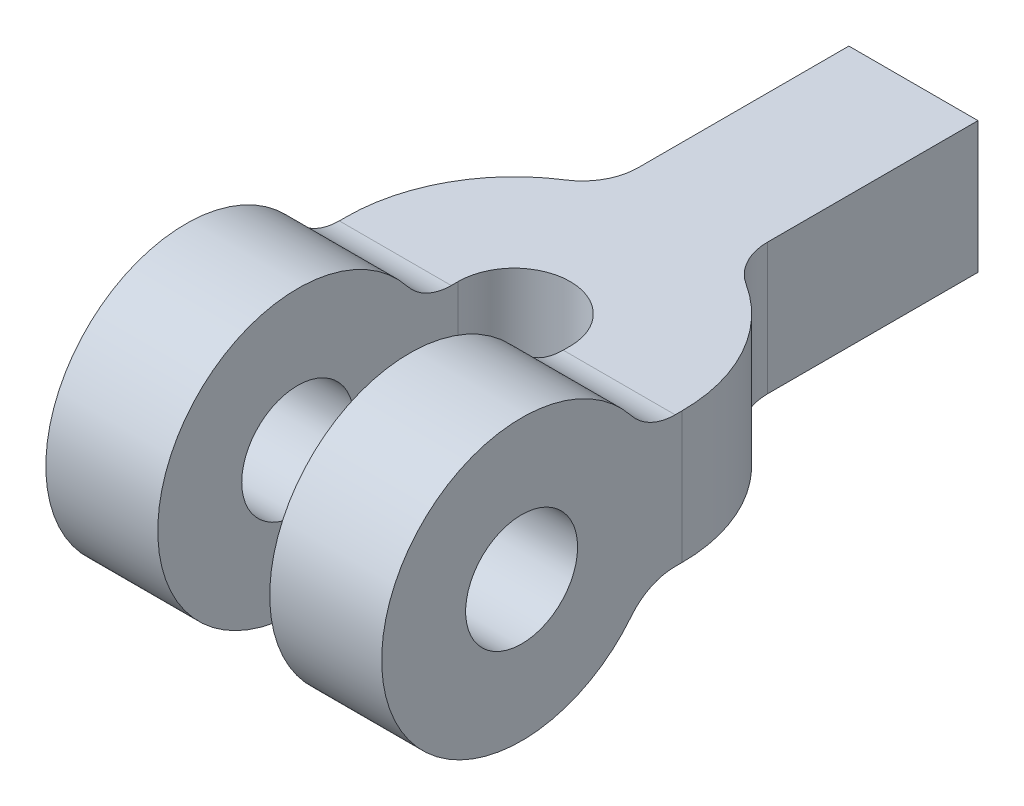
ISO-10303-21;
HEADER;
FILE_DESCRIPTION(('STEP AP214'),'2;1');
FILE_NAME('part.step','',(''),(''),'','','');
FILE_SCHEMA(('AUTOMOTIVE_DESIGN { 1 0 10303 214 1 1 1 1 }'));
ENDSEC;
DATA;
#1=APPLICATION_CONTEXT('core data for automotive mechanical design processes');
#2=APPLICATION_PROTOCOL_DEFINITION('international standard','automotive_design',2000,#1);
#3=PRODUCT_CONTEXT('',#1,'mechanical');
#4=PRODUCT('Part','Part','',(#3));
#5=PRODUCT_RELATED_PRODUCT_CATEGORY('part','',(#4));
#6=PRODUCT_DEFINITION_FORMATION('','',#4);
#7=PRODUCT_DEFINITION_CONTEXT('part definition',#1,'design');
#8=PRODUCT_DEFINITION('design','',#6,#7);
#9=PRODUCT_DEFINITION_SHAPE('','',#8);
#10=(LENGTH_UNIT() NAMED_UNIT(*) SI_UNIT(.MILLI.,.METRE.));
#11=(NAMED_UNIT(*) PLANE_ANGLE_UNIT() SI_UNIT($,.RADIAN.));
#12=(NAMED_UNIT(*) SI_UNIT($,.STERADIAN.) SOLID_ANGLE_UNIT());
#13=UNCERTAINTY_MEASURE_WITH_UNIT(LENGTH_MEASURE(1.E-05),#10,'distance_accuracy_value','');
#14=(GEOMETRIC_REPRESENTATION_CONTEXT(3) GLOBAL_UNCERTAINTY_ASSIGNED_CONTEXT((#13)) GLOBAL_UNIT_ASSIGNED_CONTEXT((#10,
#11,#12)) REPRESENTATION_CONTEXT('',''));
#15=CARTESIAN_POINT('',(0.,0.,0.));
#16=DIRECTION('',(0.,0.,1.));
#17=DIRECTION('',(1.,0.,0.));
#18=AXIS2_PLACEMENT_3D('',#15,#16,#17);
#19=CARTESIAN_POINT('',(-21.,67.5,58.8508644021294));
#20=DIRECTION('',(1.,0.,0.));
#21=DIRECTION('',(0.,0.,-1.));
#22=AXIS2_PLACEMENT_3D('',#19,#20,#21);
#23=PLANE('',#22);
#24=CARTESIAN_POINT('',(-21.,50.,41.3508644021294));
#25=DIRECTION('',(1.,0.,0.));
#26=DIRECTION('',(0.,0.,-1.));
#27=AXIS2_PLACEMENT_3D('',#24,#25,#26);
#28=CIRCLE('',#27,7.);
#29=CARTESIAN_POINT('',(-21.,50.,34.3508644021294));
#30=VERTEX_POINT('',#29);
#31=EDGE_CURVE('E286',#30,#30,#28,.T.);
#32=ORIENTED_EDGE('',*,*,#31,.T.);
#33=EDGE_LOOP('',(#32));
#34=FACE_BOUND('',#33,.T.);
#35=DIRECTION('',(0.,0.,-1.));
#36=VECTOR('',#35,1.);
#37=CARTESIAN_POINT('',(-21.,41.7837570915777,15.1008644021294));
#38=LINE('',#37,#36);
#39=CARTESIAN_POINT('',(-21.,41.7837570915777,22.1488865937918));
#40=VERTEX_POINT('',#39);
#41=CARTESIAN_POINT('',(-21.,41.7837570915777,21.2764778737688));
#42=VERTEX_POINT('',#41);
#43=EDGE_CURVE('E190',#40,#42,#38,.T.);
#44=ORIENTED_EDGE('',*,*,#43,.F.);
#45=CARTESIAN_POINT('',(-21.,34.7837570915777,22.1488865937918));
#46=DIRECTION('',(1.,0.,0.));
#47=DIRECTION('',(0.,0.,-1.));
#48=AXIS2_PLACEMENT_3D('',#45,#46,#47);
#49=CIRCLE('',#48,7.);
#50=CARTESIAN_POINT('',(-21.,39.1312550654127,27.6351659676026));
#51=VERTEX_POINT('',#50);
#52=EDGE_CURVE('E200',#40,#51,#49,.T.);
#53=ORIENTED_EDGE('',*,*,#52,.T.);
#54=CARTESIAN_POINT('',(-21.,50.,41.3508644021294));
#55=DIRECTION('',(1.,0.,0.));
#56=DIRECTION('',(0.,0.,-1.));
#57=AXIS2_PLACEMENT_3D('',#54,#55,#56);
#58=CIRCLE('',#57,17.5);
#59=CARTESIAN_POINT('',(-21.,60.8687449345873,27.6351659676026));
#60=VERTEX_POINT('',#59);
#61=EDGE_CURVE('E296',#60,#51,#58,.T.);
#62=ORIENTED_EDGE('',*,*,#61,.F.);
#63=CARTESIAN_POINT('',(-21.,65.2162429084223,22.1488865937918));
#64=DIRECTION('',(1.,0.,0.));
#65=DIRECTION('',(0.,0.,-1.));
#66=AXIS2_PLACEMENT_3D('',#63,#64,#65);
#67=CIRCLE('',#66,7.);
#68=CARTESIAN_POINT('',(-21.,58.2162429084223,22.1488865937918));
#69=VERTEX_POINT('',#68);
#70=EDGE_CURVE('E223',#69,#60,#67,.F.);
#71=ORIENTED_EDGE('',*,*,#70,.F.);
#72=DIRECTION('',(0.,0.,-1.));
#73=VECTOR('',#72,1.);
#74=CARTESIAN_POINT('',(-21.,58.2162429084223,15.1008644021294));
#75=LINE('',#74,#73);
#76=CARTESIAN_POINT('',(-21.,58.2162429084223,21.2764778737688));
#77=VERTEX_POINT('',#76);
#78=EDGE_CURVE('E226',#69,#77,#75,.T.);
#79=ORIENTED_EDGE('',*,*,#78,.T.);
#80=DIRECTION('',(0.,1.,0.));
#81=VECTOR('',#80,1.);
#82=CARTESIAN_POINT('',(-21.,32.5,21.2764778737688));
#83=LINE('',#82,#81);
#84=EDGE_CURVE('E209',#42,#77,#83,.T.);
#85=ORIENTED_EDGE('',*,*,#84,.F.);
#86=EDGE_LOOP('',(#44,#53,#62,#71,#79,#85));
#87=FACE_BOUND('',#86,.T.);
#88=ADVANCED_FACE('F62',(#34,#87),#23,.F.);
#89=CARTESIAN_POINT('',(21.,67.5,58.8508644021294));
#90=DIRECTION('',(-1.,0.,0.));
#91=DIRECTION('',(0.,0.,1.));
#92=AXIS2_PLACEMENT_3D('',#89,#90,#91);
#93=PLANE('',#92);
#94=CARTESIAN_POINT('',(21.,50.,41.3508644021294));
#95=DIRECTION('',(1.,0.,0.));
#96=DIRECTION('',(0.,0.,-1.));
#97=AXIS2_PLACEMENT_3D('',#94,#95,#96);
#98=CIRCLE('',#97,7.);
#99=CARTESIAN_POINT('',(21.,50.,34.3508644021294));
#100=VERTEX_POINT('',#99);
#101=EDGE_CURVE('E285',#100,#100,#98,.T.);
#102=ORIENTED_EDGE('',*,*,#101,.F.);
#103=EDGE_LOOP('',(#102));
#104=FACE_BOUND('',#103,.T.);
#105=DIRECTION('',(0.,0.,-1.));
#106=VECTOR('',#105,1.);
#107=CARTESIAN_POINT('',(21.,41.7837570915777,15.1008644021294));
#108=LINE('',#107,#106);
#109=CARTESIAN_POINT('',(21.,41.7837570915777,22.1488865937918));
#110=VERTEX_POINT('',#109);
#111=CARTESIAN_POINT('',(21.,41.7837570915777,21.2764778737688));
#112=VERTEX_POINT('',#111);
#113=EDGE_CURVE('E213',#110,#112,#108,.T.);
#114=ORIENTED_EDGE('',*,*,#113,.T.);
#115=DIRECTION('',(0.,1.,0.));
#116=VECTOR('',#115,1.);
#117=CARTESIAN_POINT('',(21.,32.5,21.2764778737688));
#118=LINE('',#117,#116);
#119=CARTESIAN_POINT('',(21.,58.2162429084223,21.2764778737688));
#120=VERTEX_POINT('',#119);
#121=EDGE_CURVE('E314',#112,#120,#118,.T.);
#122=ORIENTED_EDGE('',*,*,#121,.T.);
#123=DIRECTION('',(0.,0.,-1.));
#124=VECTOR('',#123,1.);
#125=CARTESIAN_POINT('',(21.,58.2162429084223,15.1008644021294));
#126=LINE('',#125,#124);
#127=CARTESIAN_POINT('',(21.,58.2162429084223,22.1488865937918));
#128=VERTEX_POINT('',#127);
#129=EDGE_CURVE('E227',#128,#120,#126,.T.);
#130=ORIENTED_EDGE('',*,*,#129,.F.);
#131=CARTESIAN_POINT('',(21.,65.2162429084223,22.1488865937918));
#132=DIRECTION('',(1.,0.,0.));
#133=DIRECTION('',(0.,0.,-1.));
#134=AXIS2_PLACEMENT_3D('',#131,#132,#133);
#135=CIRCLE('',#134,7.);
#136=CARTESIAN_POINT('',(21.,60.8687449345873,27.6351659676026));
#137=VERTEX_POINT('',#136);
#138=EDGE_CURVE('E230',#128,#137,#135,.F.);
#139=ORIENTED_EDGE('',*,*,#138,.T.);
#140=CARTESIAN_POINT('',(21.,50.,41.3508644021294));
#141=DIRECTION('',(1.,0.,0.));
#142=DIRECTION('',(0.,0.,-1.));
#143=AXIS2_PLACEMENT_3D('',#140,#141,#142);
#144=CIRCLE('',#143,17.5);
#145=CARTESIAN_POINT('',(21.,39.1312550654127,27.6351659676026));
#146=VERTEX_POINT('',#145);
#147=EDGE_CURVE('E295',#137,#146,#144,.T.);
#148=ORIENTED_EDGE('',*,*,#147,.T.);
#149=CARTESIAN_POINT('',(21.,34.7837570915777,22.1488865937918));
#150=DIRECTION('',(1.,0.,0.));
#151=DIRECTION('',(0.,0.,-1.));
#152=AXIS2_PLACEMENT_3D('',#149,#150,#151);
#153=CIRCLE('',#152,7.);
#154=EDGE_CURVE('E210',#110,#146,#153,.T.);
#155=ORIENTED_EDGE('',*,*,#154,.F.);
#156=EDGE_LOOP('',(#114,#122,#130,#139,#148,#155));
#157=FACE_BOUND('',#156,.T.);
#158=ADVANCED_FACE('F361',(#104,#157),#93,.F.);
#159=CARTESIAN_POINT('',(7.00000000000002,32.5,15.1008644021294));
#160=DIRECTION('',(-1.,0.,0.));
#161=DIRECTION('',(0.,0.,1.));
#162=AXIS2_PLACEMENT_3D('',#159,#160,#161);
#163=PLANE('',#162);
#164=CARTESIAN_POINT('',(7.00000000000002,50.,41.3508644021294));
#165=DIRECTION('',(-1.,0.,0.));
#166=DIRECTION('',(0.,0.,1.));
#167=AXIS2_PLACEMENT_3D('',#164,#165,#166);
#168=CIRCLE('',#167,7.);
#169=CARTESIAN_POINT('',(7.00000000000002,50.,48.3508644021294));
#170=VERTEX_POINT('',#169);
#171=EDGE_CURVE('E292',#170,#170,#168,.T.);
#172=ORIENTED_EDGE('',*,*,#171,.F.);
#173=EDGE_LOOP('',(#172));
#174=FACE_BOUND('',#173,.T.);
#175=DIRECTION('',(0.,1.,0.));
#176=VECTOR('',#175,1.);
#177=CARTESIAN_POINT('',(7.00000000000002,32.5,21.2764778737688));
#178=LINE('',#177,#176);
#179=CARTESIAN_POINT('',(7.00000000000002,41.7837570915777,21.2764778737688));
#180=VERTEX_POINT('',#179);
#181=CARTESIAN_POINT('',(7.00000000000002,58.2162429084223,21.2764778737688));
#182=VERTEX_POINT('',#181);
#183=EDGE_CURVE('E323',#180,#182,#178,.T.);
#184=ORIENTED_EDGE('',*,*,#183,.F.);
#185=DIRECTION('',(0.,0.,1.));
#186=VECTOR('',#185,1.);
#187=CARTESIAN_POINT('',(7.00000000000002,41.7837570915777,15.1008644021294));
#188=LINE('',#187,#186);
#189=CARTESIAN_POINT('',(7.00000000000002,41.7837570915777,22.1488865937918));
#190=VERTEX_POINT('',#189);
#191=EDGE_CURVE('E277',#180,#190,#188,.T.);
#192=ORIENTED_EDGE('',*,*,#191,.T.);
#193=CARTESIAN_POINT('',(7.00000000000002,34.7837570915777,22.1488865937918));
#194=DIRECTION('',(-1.,0.,0.));
#195=DIRECTION('',(0.,0.,1.));
#196=AXIS2_PLACEMENT_3D('',#193,#194,#195);
#197=CIRCLE('',#196,7.);
#198=CARTESIAN_POINT('',(7.00000000000002,39.1312550654127,27.6351659676026));
#199=VERTEX_POINT('',#198);
#200=EDGE_CURVE('E283',#199,#190,#197,.T.);
#201=ORIENTED_EDGE('',*,*,#200,.F.);
#202=CARTESIAN_POINT('',(7.00000000000002,50.,41.3508644021294));
#203=DIRECTION('',(-1.,0.,0.));
#204=DIRECTION('',(0.,0.,1.));
#205=AXIS2_PLACEMENT_3D('',#202,#203,#204);
#206=CIRCLE('',#205,17.5);
#207=CARTESIAN_POINT('',(7.00000000000002,60.8687449345873,27.6351659676026));
#208=VERTEX_POINT('',#207);
#209=EDGE_CURVE('E76',#199,#208,#206,.T.);
#210=ORIENTED_EDGE('',*,*,#209,.T.);
#211=CARTESIAN_POINT('',(7.00000000000002,65.2162429084223,22.1488865937918));
#212=DIRECTION('',(-1.,0.,0.));
#213=DIRECTION('',(0.,0.,1.));
#214=AXIS2_PLACEMENT_3D('',#211,#212,#213);
#215=CIRCLE('',#214,7.);
#216=CARTESIAN_POINT('',(7.00000000000002,58.2162429084223,22.1488865937918));
#217=VERTEX_POINT('',#216);
#218=EDGE_CURVE('E280',#208,#217,#215,.F.);
#219=ORIENTED_EDGE('',*,*,#218,.T.);
#220=DIRECTION('',(0.,0.,1.));
#221=VECTOR('',#220,1.);
#222=CARTESIAN_POINT('',(7.00000000000002,58.2162429084223,15.1008644021294));
#223=LINE('',#222,#221);
#224=EDGE_CURVE('E260',#182,#217,#223,.T.);
#225=ORIENTED_EDGE('',*,*,#224,.F.);
#226=EDGE_LOOP('',(#184,#192,#201,#210,#219,#225));
#227=FACE_BOUND('',#226,.T.);
#228=ADVANCED_FACE('F351',(#174,#227),#163,.T.);
#229=CARTESIAN_POINT('',(-6.99999999999998,32.5,15.1008644021294));
#230=DIRECTION('',(-1.,0.,0.));
#231=DIRECTION('',(0.,0.,1.));
#232=AXIS2_PLACEMENT_3D('',#229,#230,#231);
#233=PLANE('',#232);
#234=CARTESIAN_POINT('',(-6.99999999999998,50.,41.3508644021294));
#235=DIRECTION('',(-1.,0.,0.));
#236=DIRECTION('',(0.,0.,1.));
#237=AXIS2_PLACEMENT_3D('',#234,#235,#236);
#238=CIRCLE('',#237,7.);
#239=CARTESIAN_POINT('',(-6.99999999999998,50.,48.3508644021294));
#240=VERTEX_POINT('',#239);
#241=EDGE_CURVE('E289',#240,#240,#238,.T.);
#242=ORIENTED_EDGE('',*,*,#241,.T.);
#243=EDGE_LOOP('',(#242));
#244=FACE_BOUND('',#243,.T.);
#245=DIRECTION('',(0.,0.,1.));
#246=VECTOR('',#245,1.);
#247=CARTESIAN_POINT('',(-6.99999999999998,41.7837570915777,15.1008644021294));
#248=LINE('',#247,#246);
#249=CARTESIAN_POINT('',(-6.99999999999999,41.7837570915777,21.2764778737688));
#250=VERTEX_POINT('',#249);
#251=CARTESIAN_POINT('',(-6.99999999999998,41.7837570915777,22.1488865937918));
#252=VERTEX_POINT('',#251);
#253=EDGE_CURVE('E193',#250,#252,#248,.T.);
#254=ORIENTED_EDGE('',*,*,#253,.F.);
#255=DIRECTION('',(0.,1.,0.));
#256=VECTOR('',#255,1.);
#257=CARTESIAN_POINT('',(-6.99999999999999,32.5,21.2764778737688));
#258=LINE('',#257,#256);
#259=CARTESIAN_POINT('',(-6.99999999999999,58.2162429084223,21.2764778737688));
#260=VERTEX_POINT('',#259);
#261=EDGE_CURVE('E300',#250,#260,#258,.T.);
#262=ORIENTED_EDGE('',*,*,#261,.T.);
#263=DIRECTION('',(0.,0.,1.));
#264=VECTOR('',#263,1.);
#265=CARTESIAN_POINT('',(-6.99999999999998,58.2162429084223,15.1008644021294));
#266=LINE('',#265,#264);
#267=CARTESIAN_POINT('',(-6.99999999999998,58.2162429084223,22.1488865937918));
#268=VERTEX_POINT('',#267);
#269=EDGE_CURVE('E257',#260,#268,#266,.T.);
#270=ORIENTED_EDGE('',*,*,#269,.T.);
#271=CARTESIAN_POINT('',(-6.99999999999998,65.2162429084223,22.1488865937918));
#272=DIRECTION('',(-1.,0.,0.));
#273=DIRECTION('',(0.,0.,1.));
#274=AXIS2_PLACEMENT_3D('',#271,#272,#273);
#275=CIRCLE('',#274,7.);
#276=CARTESIAN_POINT('',(-6.99999999999998,60.8687449345873,27.6351659676026));
#277=VERTEX_POINT('',#276);
#278=EDGE_CURVE('E69',#277,#268,#275,.F.);
#279=ORIENTED_EDGE('',*,*,#278,.F.);
#280=CARTESIAN_POINT('',(-6.99999999999998,50.,41.3508644021294));
#281=DIRECTION('',(-1.,0.,0.));
#282=DIRECTION('',(0.,0.,1.));
#283=AXIS2_PLACEMENT_3D('',#280,#281,#282);
#284=CIRCLE('',#283,17.5);
#285=CARTESIAN_POINT('',(-6.99999999999998,39.1312550654127,27.6351659676026));
#286=VERTEX_POINT('',#285);
#287=EDGE_CURVE('E83',#286,#277,#284,.T.);
#288=ORIENTED_EDGE('',*,*,#287,.F.);
#289=CARTESIAN_POINT('',(-6.99999999999998,34.7837570915777,22.1488865937918));
#290=DIRECTION('',(-1.,0.,0.));
#291=DIRECTION('',(0.,0.,1.));
#292=AXIS2_PLACEMENT_3D('',#289,#290,#291);
#293=CIRCLE('',#292,7.);
#294=EDGE_CURVE('E12',#286,#252,#293,.T.);
#295=ORIENTED_EDGE('',*,*,#294,.T.);
#296=EDGE_LOOP('',(#254,#262,#270,#279,#288,#295));
#297=FACE_BOUND('',#296,.T.);
#298=ADVANCED_FACE('F342',(#244,#297),#233,.F.);
#299=CARTESIAN_POINT('',(21.,67.5,-28.6491355978706));
#300=DIRECTION('',(0.,0.,1.));
#301=DIRECTION('',(1.,0.,0.));
#302=AXIS2_PLACEMENT_3D('',#299,#300,#301);
#303=PLANE('',#302);
#304=DIRECTION('',(1.,0.,0.));
#305=VECTOR('',#304,1.);
#306=CARTESIAN_POINT('',(-21.,41.7837570915777,-28.6491355978706));
#307=LINE('',#306,#305);
#308=CARTESIAN_POINT('',(-8.07509837913044,41.7837570915777,-28.6491355978706));
#309=VERTEX_POINT('',#308);
#310=CARTESIAN_POINT('',(8.07509837913047,41.7837570915777,-28.6491355978706));
#311=VERTEX_POINT('',#310);
#312=EDGE_CURVE('E219',#309,#311,#307,.T.);
#313=ORIENTED_EDGE('',*,*,#312,.F.);
#314=DIRECTION('',(0.,1.,0.));
#315=VECTOR('',#314,1.);
#316=CARTESIAN_POINT('',(-8.07509837913044,32.5,-28.6491355978706));
#317=LINE('',#316,#315);
#318=CARTESIAN_POINT('',(-8.07509837913044,58.2162429084223,-28.6491355978706));
#319=VERTEX_POINT('',#318);
#320=EDGE_CURVE('E302',#309,#319,#317,.T.);
#321=ORIENTED_EDGE('',*,*,#320,.T.);
#322=DIRECTION('',(1.,0.,0.));
#323=VECTOR('',#322,1.);
#324=CARTESIAN_POINT('',(-21.,58.2162429084223,-28.6491355978706));
#325=LINE('',#324,#323);
#326=CARTESIAN_POINT('',(8.07509837913047,58.2162429084223,-28.6491355978706));
#327=VERTEX_POINT('',#326);
#328=EDGE_CURVE('E237',#319,#327,#325,.T.);
#329=ORIENTED_EDGE('',*,*,#328,.T.);
#330=DIRECTION('',(0.,1.,0.));
#331=VECTOR('',#330,1.);
#332=CARTESIAN_POINT('',(8.07509837913047,32.5,-28.6491355978706));
#333=LINE('',#332,#331);
#334=EDGE_CURVE('E311',#311,#327,#333,.T.);
#335=ORIENTED_EDGE('',*,*,#334,.F.);
#336=EDGE_LOOP('',(#313,#321,#329,#335));
#337=FACE_BOUND('',#336,.T.);
#338=ADVANCED_FACE('F378',(#337),#303,.F.);
#339=CARTESIAN_POINT('',(0.,32.5,21.2764778737688));
#340=DIRECTION('',(0.,1.,0.));
#341=DIRECTION('',(0.,0.,1.));
#342=AXIS2_PLACEMENT_3D('',#339,#340,#341);
#343=CYLINDRICAL_SURFACE('',#342,7.);
#344=CARTESIAN_POINT('',(0.,41.7837570915777,21.2764778737688));
#345=DIRECTION('',(0.,-1.,0.));
#346=DIRECTION('',(0.,0.,-1.));
#347=AXIS2_PLACEMENT_3D('',#344,#345,#346);
#348=CIRCLE('',#347,7.);
#349=EDGE_CURVE('E274',#180,#250,#348,.F.);
#350=ORIENTED_EDGE('',*,*,#349,.F.);
#351=ORIENTED_EDGE('',*,*,#183,.T.);
#352=CARTESIAN_POINT('',(0.,58.2162429084223,21.2764778737688));
#353=DIRECTION('',(0.,-1.,0.));
#354=DIRECTION('',(0.,0.,-1.));
#355=AXIS2_PLACEMENT_3D('',#352,#353,#354);
#356=CIRCLE('',#355,7.);
#357=EDGE_CURVE('E254',#182,#260,#356,.F.);
#358=ORIENTED_EDGE('',*,*,#357,.T.);
#359=ORIENTED_EDGE('',*,*,#261,.F.);
#360=EDGE_LOOP('',(#350,#351,#358,#359));
#361=FACE_BOUND('',#360,.T.);
#362=ADVANCED_FACE('F346',(#361),#343,.F.);
#363=CARTESIAN_POINT('',(8.07509837913047,32.5,15.1008644021294));
#364=DIRECTION('',(-1.,0.,0.));
#365=DIRECTION('',(0.,0.,1.));
#366=AXIS2_PLACEMENT_3D('',#363,#364,#365);
#367=PLANE('',#366);
#368=DIRECTION('',(0.,0.,1.));
#369=VECTOR('',#368,1.);
#370=CARTESIAN_POINT('',(8.07509837913047,41.7837570915777,15.1008644021294));
#371=LINE('',#370,#369);
#372=CARTESIAN_POINT('',(8.07509837913047,41.7837570915777,-2.31889050351102));
#373=VERTEX_POINT('',#372);
#374=EDGE_CURVE('E272',#311,#373,#371,.T.);
#375=ORIENTED_EDGE('',*,*,#374,.F.);
#376=ORIENTED_EDGE('',*,*,#334,.T.);
#377=DIRECTION('',(0.,0.,1.));
#378=VECTOR('',#377,1.);
#379=CARTESIAN_POINT('',(8.07509837913047,58.2162429084223,15.1008644021294));
#380=LINE('',#379,#378);
#381=CARTESIAN_POINT('',(8.07509837913047,58.2162429084223,-2.31889050351102));
#382=VERTEX_POINT('',#381);
#383=EDGE_CURVE('E251',#327,#382,#380,.T.);
#384=ORIENTED_EDGE('',*,*,#383,.T.);
#385=DIRECTION('',(0.,1.,0.));
#386=VECTOR('',#385,1.);
#387=CARTESIAN_POINT('',(8.07509837913047,32.5,-2.31889050351102));
#388=LINE('',#387,#386);
#389=EDGE_CURVE('E320',#373,#382,#388,.T.);
#390=ORIENTED_EDGE('',*,*,#389,.F.);
#391=EDGE_LOOP('',(#375,#376,#384,#390));
#392=FACE_BOUND('',#391,.T.);
#393=ADVANCED_FACE('F374',(#392),#367,.F.);
#394=CARTESIAN_POINT('',(0.,32.5,21.2764778737688));
#395=DIRECTION('',(0.,1.,0.));
#396=DIRECTION('',(0.,0.,1.));
#397=AXIS2_PLACEMENT_3D('',#394,#395,#396);
#398=CYLINDRICAL_SURFACE('',#397,21.);
#399=ORIENTED_EDGE('',*,*,#121,.F.);
#400=CARTESIAN_POINT('',(0.,41.7837570915777,21.2764778737688));
#401=DIRECTION('',(0.,-1.,0.));
#402=DIRECTION('',(0.,0.,-1.));
#403=AXIS2_PLACEMENT_3D('',#400,#401,#402);
#404=CIRCLE('',#403,21.);
#405=CARTESIAN_POINT('',(11.3063237843479,41.7837570915777,3.57995159080893));
#406=VERTEX_POINT('',#405);
#407=EDGE_CURVE('E269',#112,#406,#404,.F.);
#408=ORIENTED_EDGE('',*,*,#407,.T.);
#409=DIRECTION('',(0.,1.,0.));
#410=VECTOR('',#409,1.);
#411=CARTESIAN_POINT('',(11.3063237843479,32.5,3.57995159080893));
#412=LINE('',#411,#410);
#413=CARTESIAN_POINT('',(11.3063237843479,58.2162429084223,3.57995159080893));
#414=VERTEX_POINT('',#413);
#415=EDGE_CURVE('E317',#406,#414,#412,.T.);
#416=ORIENTED_EDGE('',*,*,#415,.T.);
#417=CARTESIAN_POINT('',(0.,58.2162429084223,21.2764778737688));
#418=DIRECTION('',(0.,-1.,0.));
#419=DIRECTION('',(0.,0.,-1.));
#420=AXIS2_PLACEMENT_3D('',#417,#418,#419);
#421=CIRCLE('',#420,21.);
#422=EDGE_CURVE('E249',#120,#414,#421,.F.);
#423=ORIENTED_EDGE('',*,*,#422,.F.);
#424=EDGE_LOOP('',(#399,#408,#416,#423));
#425=FACE_BOUND('',#424,.T.);
#426=ADVANCED_FACE('F366',(#425),#398,.T.);
#427=CARTESIAN_POINT('',(15.0750983791305,32.5,-2.31889050351102));
#428=DIRECTION('',(0.,1.,0.));
#429=DIRECTION('',(0.,0.,1.));
#430=AXIS2_PLACEMENT_3D('',#427,#428,#429);
#431=CYLINDRICAL_SURFACE('',#430,7.);
#432=CARTESIAN_POINT('',(15.0750983791305,41.7837570915777,-2.31889050351102));
#433=DIRECTION('',(0.,-1.,0.));
#434=DIRECTION('',(0.,0.,-1.));
#435=AXIS2_PLACEMENT_3D('',#432,#433,#434);
#436=CIRCLE('',#435,7.);
#437=EDGE_CURVE('E267',#373,#406,#436,.F.);
#438=ORIENTED_EDGE('',*,*,#437,.F.);
#439=ORIENTED_EDGE('',*,*,#389,.T.);
#440=CARTESIAN_POINT('',(15.0750983791305,58.2162429084223,-2.31889050351102));
#441=DIRECTION('',(0.,-1.,0.));
#442=DIRECTION('',(0.,0.,-1.));
#443=AXIS2_PLACEMENT_3D('',#440,#441,#442);
#444=CIRCLE('',#443,7.);
#445=EDGE_CURVE('E246',#382,#414,#444,.F.);
#446=ORIENTED_EDGE('',*,*,#445,.T.);
#447=ORIENTED_EDGE('',*,*,#415,.F.);
#448=EDGE_LOOP('',(#438,#439,#446,#447));
#449=FACE_BOUND('',#448,.T.);
#450=ADVANCED_FACE('F370',(#449),#431,.F.);
#451=CARTESIAN_POINT('',(0.,32.5,21.2764778737688));
#452=DIRECTION('',(0.,1.,0.));
#453=DIRECTION('',(0.,0.,1.));
#454=AXIS2_PLACEMENT_3D('',#451,#452,#453);
#455=CYLINDRICAL_SURFACE('',#454,21.);
#456=DIRECTION('',(0.,1.,0.));
#457=VECTOR('',#456,1.);
#458=CARTESIAN_POINT('',(-11.3063237843478,32.5,3.57995159080893));
#459=LINE('',#458,#457);
#460=CARTESIAN_POINT('',(-11.3063237843478,41.7837570915777,3.57995159080893));
#461=VERTEX_POINT('',#460);
#462=CARTESIAN_POINT('',(-11.3063237843478,58.2162429084223,3.57995159080893));
#463=VERTEX_POINT('',#462);
#464=EDGE_CURVE('E308',#461,#463,#459,.T.);
#465=ORIENTED_EDGE('',*,*,#464,.F.);
#466=CARTESIAN_POINT('',(0.,41.7837570915777,21.2764778737688));
#467=DIRECTION('',(0.,-1.,0.));
#468=DIRECTION('',(0.,0.,-1.));
#469=AXIS2_PLACEMENT_3D('',#466,#467,#468);
#470=CIRCLE('',#469,21.);
#471=EDGE_CURVE('E265',#461,#42,#470,.F.);
#472=ORIENTED_EDGE('',*,*,#471,.T.);
#473=ORIENTED_EDGE('',*,*,#84,.T.);
#474=CARTESIAN_POINT('',(0.,58.2162429084223,21.2764778737688));
#475=DIRECTION('',(0.,-1.,0.));
#476=DIRECTION('',(0.,0.,-1.));
#477=AXIS2_PLACEMENT_3D('',#474,#475,#476);
#478=CIRCLE('',#477,21.);
#479=EDGE_CURVE('E244',#463,#77,#478,.F.);
#480=ORIENTED_EDGE('',*,*,#479,.F.);
#481=EDGE_LOOP('',(#465,#472,#473,#480));
#482=FACE_BOUND('',#481,.T.);
#483=ADVANCED_FACE('F390',(#482),#455,.T.);
#484=CARTESIAN_POINT('',(-8.07509837913044,32.5,15.1008644021294));
#485=DIRECTION('',(-1.,0.,0.));
#486=DIRECTION('',(0.,0.,1.));
#487=AXIS2_PLACEMENT_3D('',#484,#485,#486);
#488=PLANE('',#487);
#489=ORIENTED_EDGE('',*,*,#320,.F.);
#490=DIRECTION('',(0.,0.,1.));
#491=VECTOR('',#490,1.);
#492=CARTESIAN_POINT('',(-8.07509837913044,41.7837570915777,15.1008644021294));
#493=LINE('',#492,#491);
#494=CARTESIAN_POINT('',(-8.07509837913044,41.7837570915777,-2.31889050351103));
#495=VERTEX_POINT('',#494);
#496=EDGE_CURVE('E262',#309,#495,#493,.T.);
#497=ORIENTED_EDGE('',*,*,#496,.T.);
#498=DIRECTION('',(0.,1.,0.));
#499=VECTOR('',#498,1.);
#500=CARTESIAN_POINT('',(-8.07509837913044,32.5,-2.31889050351103));
#501=LINE('',#500,#499);
#502=CARTESIAN_POINT('',(-8.07509837913044,58.2162429084223,-2.31889050351103));
#503=VERTEX_POINT('',#502);
#504=EDGE_CURVE('E305',#495,#503,#501,.T.);
#505=ORIENTED_EDGE('',*,*,#504,.T.);
#506=DIRECTION('',(0.,0.,1.));
#507=VECTOR('',#506,1.);
#508=CARTESIAN_POINT('',(-8.07509837913044,58.2162429084223,15.1008644021294));
#509=LINE('',#508,#507);
#510=EDGE_CURVE('E221',#319,#503,#509,.T.);
#511=ORIENTED_EDGE('',*,*,#510,.F.);
#512=EDGE_LOOP('',(#489,#497,#505,#511));
#513=FACE_BOUND('',#512,.T.);
#514=ADVANCED_FACE('F382',(#513),#488,.T.);
#515=CARTESIAN_POINT('',(-15.0750983791304,32.5,-2.31889050351103));
#516=DIRECTION('',(0.,1.,0.));
#517=DIRECTION('',(0.,0.,1.));
#518=AXIS2_PLACEMENT_3D('',#515,#516,#517);
#519=CYLINDRICAL_SURFACE('',#518,7.);
#520=CARTESIAN_POINT('',(-15.0750983791304,41.7837570915777,-2.31889050351103));
#521=DIRECTION('',(0.,-1.,0.));
#522=DIRECTION('',(0.,0.,-1.));
#523=AXIS2_PLACEMENT_3D('',#520,#521,#522);
#524=CIRCLE('',#523,7.);
#525=EDGE_CURVE('E334',#461,#495,#524,.F.);
#526=ORIENTED_EDGE('',*,*,#525,.F.);
#527=ORIENTED_EDGE('',*,*,#464,.T.);
#528=CARTESIAN_POINT('',(-15.0750983791304,58.2162429084223,-2.31889050351103));
#529=DIRECTION('',(0.,-1.,0.));
#530=DIRECTION('',(0.,0.,-1.));
#531=AXIS2_PLACEMENT_3D('',#528,#529,#530);
#532=CIRCLE('',#531,7.);
#533=EDGE_CURVE('E329',#463,#503,#532,.F.);
#534=ORIENTED_EDGE('',*,*,#533,.T.);
#535=ORIENTED_EDGE('',*,*,#504,.F.);
#536=EDGE_LOOP('',(#526,#527,#534,#535));
#537=FACE_BOUND('',#536,.T.);
#538=ADVANCED_FACE('F386',(#537),#519,.F.);
#539=CARTESIAN_POINT('',(-21.,50.,41.3508644021294));
#540=DIRECTION('',(1.,0.,0.));
#541=DIRECTION('',(0.,0.,-1.));
#542=AXIS2_PLACEMENT_3D('',#539,#540,#541);
#543=CYLINDRICAL_SURFACE('',#542,17.5);
#544=ORIENTED_EDGE('',*,*,#287,.T.);
#545=DIRECTION('',(1.,0.,0.));
#546=VECTOR('',#545,1.);
#547=CARTESIAN_POINT('',(-21.,60.8687449345873,27.6351659676026));
#548=LINE('',#547,#546);
#549=EDGE_CURVE('E217',#60,#277,#548,.T.);
#550=ORIENTED_EDGE('',*,*,#549,.F.);
#551=ORIENTED_EDGE('',*,*,#61,.T.);
#552=DIRECTION('',(1.,0.,0.));
#553=VECTOR('',#552,1.);
#554=CARTESIAN_POINT('',(-21.,39.1312550654127,27.6351659676026));
#555=LINE('',#554,#553);
#556=EDGE_CURVE('E203',#51,#286,#555,.T.);
#557=ORIENTED_EDGE('',*,*,#556,.T.);
#558=EDGE_LOOP('',(#544,#550,#551,#557));
#559=FACE_BOUND('',#558,.T.);
#560=ADVANCED_FACE('F443',(#559),#543,.T.);
#561=ORIENTED_EDGE('',*,*,#209,.F.);
#562=EDGE_CURVE('E195',#199,#146,#555,.T.);
#563=ORIENTED_EDGE('',*,*,#562,.T.);
#564=ORIENTED_EDGE('',*,*,#147,.F.);
#565=EDGE_CURVE('E236',#208,#137,#548,.T.);
#566=ORIENTED_EDGE('',*,*,#565,.F.);
#567=EDGE_LOOP('',(#561,#563,#564,#566));
#568=FACE_BOUND('',#567,.T.);
#569=ADVANCED_FACE('F358',(#568),#543,.T.);
#570=CARTESIAN_POINT('',(-21.,50.,41.3508644021294));
#571=DIRECTION('',(1.,0.,0.));
#572=DIRECTION('',(0.,0.,-1.));
#573=AXIS2_PLACEMENT_3D('',#570,#571,#572);
#574=CYLINDRICAL_SURFACE('',#573,7.);
#575=ORIENTED_EDGE('',*,*,#31,.F.);
#576=EDGE_LOOP('',(#575));
#577=FACE_BOUND('',#576,.T.);
#578=ORIENTED_EDGE('',*,*,#241,.F.);
#579=EDGE_LOOP('',(#578));
#580=FACE_BOUND('',#579,.T.);
#581=ADVANCED_FACE('F410',(#577,#580),#574,.F.);
#582=ORIENTED_EDGE('',*,*,#171,.T.);
#583=EDGE_LOOP('',(#582));
#584=FACE_BOUND('',#583,.T.);
#585=ORIENTED_EDGE('',*,*,#101,.T.);
#586=EDGE_LOOP('',(#585));
#587=FACE_BOUND('',#586,.T.);
#588=ADVANCED_FACE('F413',(#584,#587),#574,.F.);
#589=CARTESIAN_POINT('',(-21.,65.2162429084223,22.1488865937918));
#590=DIRECTION('',(1.,0.,0.));
#591=DIRECTION('',(0.,0.,-1.));
#592=AXIS2_PLACEMENT_3D('',#589,#590,#591);
#593=CYLINDRICAL_SURFACE('',#592,7.);
#594=ORIENTED_EDGE('',*,*,#278,.T.);
#595=DIRECTION('',(1.,0.,0.));
#596=VECTOR('',#595,1.);
#597=CARTESIAN_POINT('',(-21.,58.2162429084223,22.1488865937918));
#598=LINE('',#597,#596);
#599=EDGE_CURVE('E240',#69,#268,#598,.T.);
#600=ORIENTED_EDGE('',*,*,#599,.F.);
#601=ORIENTED_EDGE('',*,*,#70,.T.);
#602=ORIENTED_EDGE('',*,*,#549,.T.);
#603=EDGE_LOOP('',(#594,#600,#601,#602));
#604=FACE_BOUND('',#603,.T.);
#605=ADVANCED_FACE('F336',(#604),#593,.F.);
#606=CARTESIAN_POINT('',(-21.,58.2162429084223,15.1008644021294));
#607=DIRECTION('',(0.,-1.,0.));
#608=DIRECTION('',(0.,0.,-1.));
#609=AXIS2_PLACEMENT_3D('',#606,#607,#608);
#610=PLANE('',#609);
#611=ORIENTED_EDGE('',*,*,#224,.T.);
#612=EDGE_CURVE('E229',#217,#128,#598,.T.);
#613=ORIENTED_EDGE('',*,*,#612,.T.);
#614=ORIENTED_EDGE('',*,*,#129,.T.);
#615=ORIENTED_EDGE('',*,*,#422,.T.);
#616=ORIENTED_EDGE('',*,*,#445,.F.);
#617=ORIENTED_EDGE('',*,*,#383,.F.);
#618=ORIENTED_EDGE('',*,*,#328,.F.);
#619=ORIENTED_EDGE('',*,*,#510,.T.);
#620=ORIENTED_EDGE('',*,*,#533,.F.);
#621=ORIENTED_EDGE('',*,*,#479,.T.);
#622=ORIENTED_EDGE('',*,*,#78,.F.);
#623=ORIENTED_EDGE('',*,*,#599,.T.);
#624=ORIENTED_EDGE('',*,*,#269,.F.);
#625=ORIENTED_EDGE('',*,*,#357,.F.);
#626=EDGE_LOOP('',(#611,#613,#614,#615,#616,#617,#618,#619,#620,#621,#622,#623,#624,#625));
#627=FACE_BOUND('',#626,.T.);
#628=ADVANCED_FACE('F340',(#627),#610,.F.);
#629=ORIENTED_EDGE('',*,*,#565,.T.);
#630=ORIENTED_EDGE('',*,*,#138,.F.);
#631=ORIENTED_EDGE('',*,*,#612,.F.);
#632=ORIENTED_EDGE('',*,*,#218,.F.);
#633=EDGE_LOOP('',(#629,#630,#631,#632));
#634=FACE_BOUND('',#633,.T.);
#635=ADVANCED_FACE('F356',(#634),#593,.F.);
#636=CARTESIAN_POINT('',(-21.,34.7837570915777,22.1488865937918));
#637=DIRECTION('',(1.,0.,0.));
#638=DIRECTION('',(0.,0.,-1.));
#639=AXIS2_PLACEMENT_3D('',#636,#637,#638);
#640=CYLINDRICAL_SURFACE('',#639,7.);
#641=ORIENTED_EDGE('',*,*,#556,.F.);
#642=ORIENTED_EDGE('',*,*,#52,.F.);
#643=DIRECTION('',(1.,0.,0.));
#644=VECTOR('',#643,1.);
#645=CARTESIAN_POINT('',(-21.,41.7837570915777,22.1488865937918));
#646=LINE('',#645,#644);
#647=EDGE_CURVE('E186',#40,#252,#646,.T.);
#648=ORIENTED_EDGE('',*,*,#647,.T.);
#649=ORIENTED_EDGE('',*,*,#294,.F.);
#650=EDGE_LOOP('',(#641,#642,#648,#649));
#651=FACE_BOUND('',#650,.T.);
#652=ADVANCED_FACE('F201',(#651),#640,.F.);
#653=CARTESIAN_POINT('',(-21.,41.7837570915777,15.1008644021294));
#654=DIRECTION('',(0.,-1.,0.));
#655=DIRECTION('',(0.,0.,-1.));
#656=AXIS2_PLACEMENT_3D('',#653,#654,#655);
#657=PLANE('',#656);
#658=ORIENTED_EDGE('',*,*,#349,.T.);
#659=ORIENTED_EDGE('',*,*,#253,.T.);
#660=ORIENTED_EDGE('',*,*,#647,.F.);
#661=ORIENTED_EDGE('',*,*,#43,.T.);
#662=ORIENTED_EDGE('',*,*,#471,.F.);
#663=ORIENTED_EDGE('',*,*,#525,.T.);
#664=ORIENTED_EDGE('',*,*,#496,.F.);
#665=ORIENTED_EDGE('',*,*,#312,.T.);
#666=ORIENTED_EDGE('',*,*,#374,.T.);
#667=ORIENTED_EDGE('',*,*,#437,.T.);
#668=ORIENTED_EDGE('',*,*,#407,.F.);
#669=ORIENTED_EDGE('',*,*,#113,.F.);
#670=EDGE_CURVE('E196',#190,#110,#646,.T.);
#671=ORIENTED_EDGE('',*,*,#670,.F.);
#672=ORIENTED_EDGE('',*,*,#191,.F.);
#673=EDGE_LOOP('',(#658,#659,#660,#661,#662,#663,#664,#665,#666,#667,#668,#669,#671,#672));
#674=FACE_BOUND('',#673,.T.);
#675=ADVANCED_FACE('F188',(#674),#657,.T.);
#676=ORIENTED_EDGE('',*,*,#200,.T.);
#677=ORIENTED_EDGE('',*,*,#670,.T.);
#678=ORIENTED_EDGE('',*,*,#154,.T.);
#679=ORIENTED_EDGE('',*,*,#562,.F.);
#680=EDGE_LOOP('',(#676,#677,#678,#679));
#681=FACE_BOUND('',#680,.T.);
#682=ADVANCED_FACE('F394',(#681),#640,.F.);
#683=CLOSED_SHELL('',(#88,#158,#228,#298,#338,#362,#393,#426,#450,#483,#514,#538,#560,#569,#581,
#588,#605,#628,#635,#652,#675,#682));
#684=MANIFOLD_SOLID_BREP('B2',#683);
#685=ADVANCED_BREP_SHAPE_REPRESENTATION('',(#18,#684),#14);
#686=SHAPE_DEFINITION_REPRESENTATION(#9,#685);
ENDSEC;
END-ISO-10303-21;
